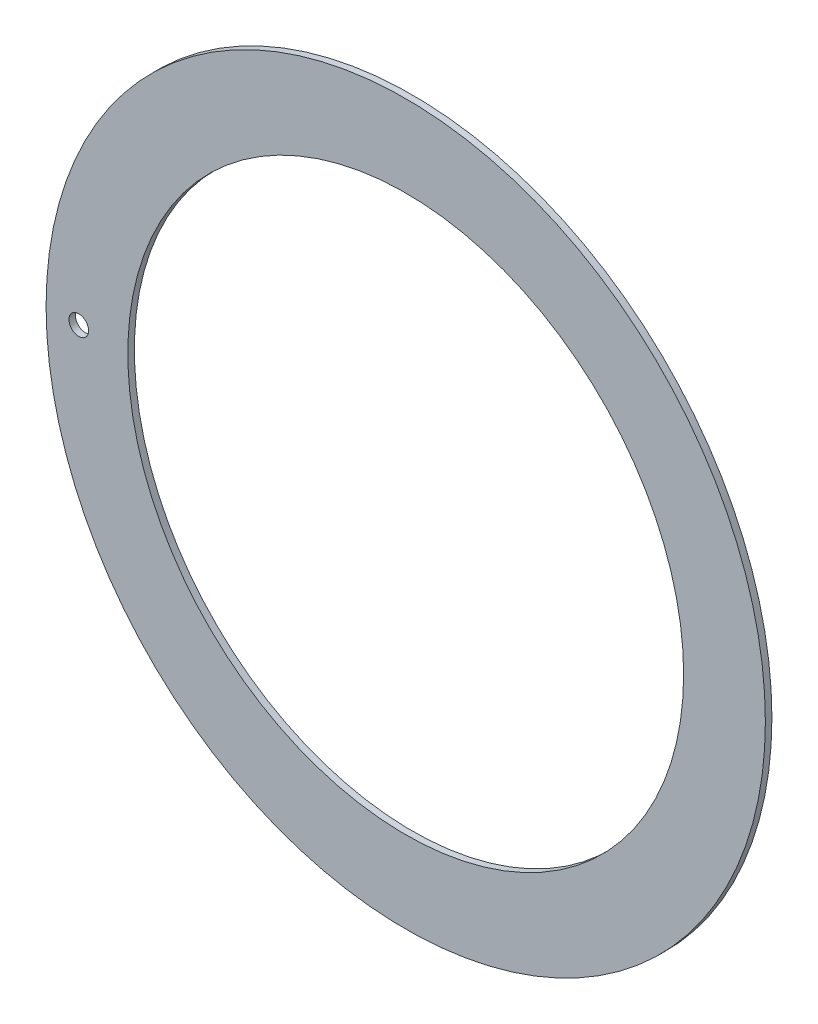
ISO-10303-21;
HEADER;
FILE_DESCRIPTION(('STEP AP214'),'2;1');
FILE_NAME('part.step','',(''),(''),'','','');
FILE_SCHEMA(('AUTOMOTIVE_DESIGN { 1 0 10303 214 1 1 1 1 }'));
ENDSEC;
DATA;
#1=APPLICATION_CONTEXT('core data for automotive mechanical design processes');
#2=APPLICATION_PROTOCOL_DEFINITION('international standard','automotive_design',2000,#1);
#3=PRODUCT_CONTEXT('',#1,'mechanical');
#4=PRODUCT('Part','Part','',(#3));
#5=PRODUCT_RELATED_PRODUCT_CATEGORY('part','',(#4));
#6=PRODUCT_DEFINITION_FORMATION('','',#4);
#7=PRODUCT_DEFINITION_CONTEXT('part definition',#1,'design');
#8=PRODUCT_DEFINITION('design','',#6,#7);
#9=PRODUCT_DEFINITION_SHAPE('','',#8);
#10=(LENGTH_UNIT() NAMED_UNIT(*) SI_UNIT(.MILLI.,.METRE.));
#11=(NAMED_UNIT(*) PLANE_ANGLE_UNIT() SI_UNIT($,.RADIAN.));
#12=(NAMED_UNIT(*) SI_UNIT($,.STERADIAN.) SOLID_ANGLE_UNIT());
#13=UNCERTAINTY_MEASURE_WITH_UNIT(LENGTH_MEASURE(1.E-05),#10,'distance_accuracy_value','');
#14=(GEOMETRIC_REPRESENTATION_CONTEXT(3) GLOBAL_UNCERTAINTY_ASSIGNED_CONTEXT((#13)) GLOBAL_UNIT_ASSIGNED_CONTEXT((#10,
#11,#12)) REPRESENTATION_CONTEXT('',''));
#15=CARTESIAN_POINT('',(0.,0.,0.));
#16=DIRECTION('',(0.,0.,1.));
#17=DIRECTION('',(1.,0.,0.));
#18=AXIS2_PLACEMENT_3D('',#15,#16,#17);
#19=CARTESIAN_POINT('',(3830.05688407984,134.884780453048,1.));
#20=DIRECTION('',(0.,0.,1.));
#21=DIRECTION('',(1.,0.,0.));
#22=AXIS2_PLACEMENT_3D('',#19,#20,#21);
#23=PLANE('',#22);
#24=CARTESIAN_POINT('',(3830.05688407984,134.884780453048,1.));
#25=DIRECTION('',(0.,0.,1.));
#26=DIRECTION('',(1.,0.,0.));
#27=AXIS2_PLACEMENT_3D('',#24,#25,#26);
#28=CIRCLE('',#27,42.5000000000001);
#29=CARTESIAN_POINT('',(3872.55688407984,134.884780453048,1.));
#30=VERTEX_POINT('',#29);
#31=EDGE_CURVE('E48',#30,#30,#28,.T.);
#32=ORIENTED_EDGE('',*,*,#31,.F.);
#33=EDGE_LOOP('',(#32));
#34=FACE_BOUND('',#33,.T.);
#35=CARTESIAN_POINT('',(3830.05688407984,134.884780453048,1.));
#36=DIRECTION('',(0.,0.,1.));
#37=DIRECTION('',(1.,0.,0.));
#38=AXIS2_PLACEMENT_3D('',#35,#36,#37);
#39=CIRCLE('',#38,55.0000000000003);
#40=CARTESIAN_POINT('',(3885.05688407984,134.884780453048,1.));
#41=VERTEX_POINT('',#40);
#42=EDGE_CURVE('E10',#41,#41,#39,.T.);
#43=ORIENTED_EDGE('',*,*,#42,.T.);
#44=EDGE_LOOP('',(#43));
#45=FACE_BOUND('',#44,.T.);
#46=CARTESIAN_POINT('',(3780.05688407984,134.884780453048,1.));
#47=DIRECTION('',(0.,0.,1.));
#48=DIRECTION('',(1.,0.,0.));
#49=AXIS2_PLACEMENT_3D('',#46,#47,#48);
#50=CIRCLE('',#49,1.50000000000009);
#51=CARTESIAN_POINT('',(3781.55688407984,134.884780453048,1.));
#52=VERTEX_POINT('',#51);
#53=EDGE_CURVE('E53',#52,#52,#50,.T.);
#54=ORIENTED_EDGE('',*,*,#53,.F.);
#55=EDGE_LOOP('',(#54));
#56=FACE_BOUND('',#55,.T.);
#57=ADVANCED_FACE('F37',(#34,#45,#56),#23,.T.);
#58=CARTESIAN_POINT('',(3830.05688407984,134.884780453048,0.));
#59=DIRECTION('',(0.,0.,1.));
#60=DIRECTION('',(1.,0.,0.));
#61=AXIS2_PLACEMENT_3D('',#58,#59,#60);
#62=PLANE('',#61);
#63=CARTESIAN_POINT('',(3830.05688407984,134.884780453048,0.));
#64=DIRECTION('',(0.,0.,1.));
#65=DIRECTION('',(1.,0.,0.));
#66=AXIS2_PLACEMENT_3D('',#63,#64,#65);
#67=CIRCLE('',#66,55.0000000000003);
#68=CARTESIAN_POINT('',(3885.05688407984,134.884780453048,0.));
#69=VERTEX_POINT('',#68);
#70=EDGE_CURVE('E41',#69,#69,#67,.T.);
#71=ORIENTED_EDGE('',*,*,#70,.F.);
#72=EDGE_LOOP('',(#71));
#73=FACE_BOUND('',#72,.T.);
#74=CARTESIAN_POINT('',(3830.05688407984,134.884780453048,0.));
#75=DIRECTION('',(0.,0.,1.));
#76=DIRECTION('',(1.,0.,0.));
#77=AXIS2_PLACEMENT_3D('',#74,#75,#76);
#78=CIRCLE('',#77,42.5000000000001);
#79=CARTESIAN_POINT('',(3872.55688407984,134.884780453048,0.));
#80=VERTEX_POINT('',#79);
#81=EDGE_CURVE('E50',#80,#80,#78,.T.);
#82=ORIENTED_EDGE('',*,*,#81,.T.);
#83=EDGE_LOOP('',(#82));
#84=FACE_BOUND('',#83,.T.);
#85=CARTESIAN_POINT('',(3780.05688407984,134.884780453048,0.));
#86=DIRECTION('',(0.,0.,1.));
#87=DIRECTION('',(1.,0.,0.));
#88=AXIS2_PLACEMENT_3D('',#85,#86,#87);
#89=CIRCLE('',#88,1.50000000000009);
#90=CARTESIAN_POINT('',(3781.55688407984,134.884780453048,0.));
#91=VERTEX_POINT('',#90);
#92=EDGE_CURVE('E56',#91,#91,#89,.T.);
#93=ORIENTED_EDGE('',*,*,#92,.T.);
#94=EDGE_LOOP('',(#93));
#95=FACE_BOUND('',#94,.T.);
#96=ADVANCED_FACE('F66',(#73,#84,#95),#62,.F.);
#97=CARTESIAN_POINT('',(3830.05688407984,134.884780453048,1.));
#98=DIRECTION('',(0.,0.,-1.));
#99=DIRECTION('',(-1.,0.,0.));
#100=AXIS2_PLACEMENT_3D('',#97,#98,#99);
#101=CYLINDRICAL_SURFACE('',#100,55.0000000000003);
#102=ORIENTED_EDGE('',*,*,#42,.F.);
#103=EDGE_LOOP('',(#102));
#104=FACE_BOUND('',#103,.T.);
#105=ORIENTED_EDGE('',*,*,#70,.T.);
#106=EDGE_LOOP('',(#105));
#107=FACE_BOUND('',#106,.T.);
#108=ADVANCED_FACE('F39',(#104,#107),#101,.T.);
#109=CARTESIAN_POINT('',(3830.05688407984,134.884780453048,1.));
#110=DIRECTION('',(0.,0.,-1.));
#111=DIRECTION('',(-1.,0.,0.));
#112=AXIS2_PLACEMENT_3D('',#109,#110,#111);
#113=CYLINDRICAL_SURFACE('',#112,42.5000000000001);
#114=ORIENTED_EDGE('',*,*,#31,.T.);
#115=EDGE_LOOP('',(#114));
#116=FACE_BOUND('',#115,.T.);
#117=ORIENTED_EDGE('',*,*,#81,.F.);
#118=EDGE_LOOP('',(#117));
#119=FACE_BOUND('',#118,.T.);
#120=ADVANCED_FACE('F75',(#116,#119),#113,.F.);
#121=CARTESIAN_POINT('',(3780.05688407984,134.884780453048,1.));
#122=DIRECTION('',(0.,0.,-1.));
#123=DIRECTION('',(-1.,0.,0.));
#124=AXIS2_PLACEMENT_3D('',#121,#122,#123);
#125=CYLINDRICAL_SURFACE('',#124,1.50000000000009);
#126=ORIENTED_EDGE('',*,*,#53,.T.);
#127=EDGE_LOOP('',(#126));
#128=FACE_BOUND('',#127,.T.);
#129=ORIENTED_EDGE('',*,*,#92,.F.);
#130=EDGE_LOOP('',(#129));
#131=FACE_BOUND('',#130,.T.);
#132=ADVANCED_FACE('F62',(#128,#131),#125,.F.);
#133=CLOSED_SHELL('',(#57,#96,#108,#120,#132));
#134=MANIFOLD_SOLID_BREP('B2',#133);
#135=ADVANCED_BREP_SHAPE_REPRESENTATION('',(#18,#134),#14);
#136=SHAPE_DEFINITION_REPRESENTATION(#9,#135);
ENDSEC;
END-ISO-10303-21;
